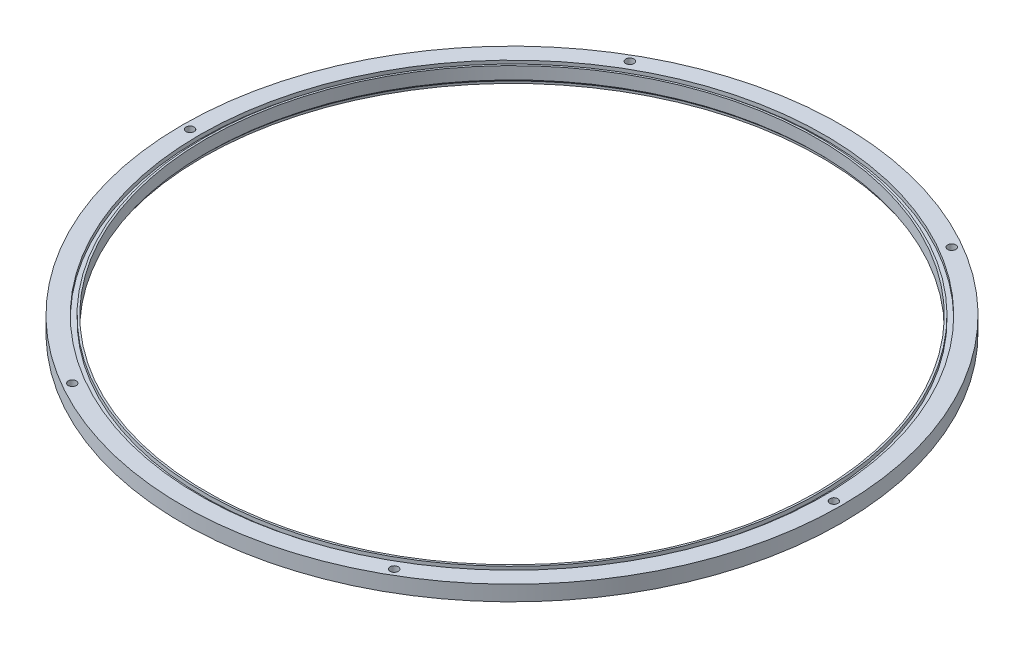
ISO-10303-21;
HEADER;
FILE_DESCRIPTION(('STEP AP214'),'2;1');
FILE_NAME('part.step','',(''),(''),'','','');
FILE_SCHEMA(('AUTOMOTIVE_DESIGN { 1 0 10303 214 1 1 1 1 }'));
ENDSEC;
DATA;
#1=APPLICATION_CONTEXT('core data for automotive mechanical design processes');
#2=APPLICATION_PROTOCOL_DEFINITION('international standard','automotive_design',2000,#1);
#3=PRODUCT_CONTEXT('',#1,'mechanical');
#4=PRODUCT('Part','Part','',(#3));
#5=PRODUCT_RELATED_PRODUCT_CATEGORY('part','',(#4));
#6=PRODUCT_DEFINITION_FORMATION('','',#4);
#7=PRODUCT_DEFINITION_CONTEXT('part definition',#1,'design');
#8=PRODUCT_DEFINITION('design','',#6,#7);
#9=PRODUCT_DEFINITION_SHAPE('','',#8);
#10=(LENGTH_UNIT() NAMED_UNIT(*) SI_UNIT(.MILLI.,.METRE.));
#11=(NAMED_UNIT(*) PLANE_ANGLE_UNIT() SI_UNIT($,.RADIAN.));
#12=(NAMED_UNIT(*) SI_UNIT($,.STERADIAN.) SOLID_ANGLE_UNIT());
#13=UNCERTAINTY_MEASURE_WITH_UNIT(LENGTH_MEASURE(1.E-05),#10,'distance_accuracy_value','');
#14=(GEOMETRIC_REPRESENTATION_CONTEXT(3) GLOBAL_UNCERTAINTY_ASSIGNED_CONTEXT((#13)) GLOBAL_UNIT_ASSIGNED_CONTEXT((#10,
#11,#12)) REPRESENTATION_CONTEXT('',''));
#15=CARTESIAN_POINT('',(0.,0.,0.));
#16=DIRECTION('',(0.,0.,1.));
#17=DIRECTION('',(1.,0.,0.));
#18=AXIS2_PLACEMENT_3D('',#15,#16,#17);
#19=CARTESIAN_POINT('',(168.5,19.,291.8505610754));
#20=DIRECTION('',(0.,-1.,0.));
#21=DIRECTION('',(0.500000000000017,0.,0.866025403784429));
#22=AXIS2_PLACEMENT_3D('',#19,#20,#21);
#23=CYLINDRICAL_SURFACE('',#22,4.25);
#24=CARTESIAN_POINT('',(168.5,19.,291.8505610754));
#25=DIRECTION('',(0.,-1.,0.));
#26=DIRECTION('',(0.500000000000017,0.,0.866025403784429));
#27=AXIS2_PLACEMENT_3D('',#24,#25,#26);
#28=CIRCLE('',#27,4.25);
#29=CARTESIAN_POINT('',(166.375,19.,288.169953109316));
#30=VERTEX_POINT('',#29);
#31=EDGE_CURVE('E204',#30,#30,#28,.T.);
#32=ORIENTED_EDGE('',*,*,#31,.F.);
#33=DIRECTION('',(0.,-1.,0.));
#34=VECTOR('',#33,1.);
#35=CARTESIAN_POINT('',(166.375,19.,288.169953109316));
#36=LINE('',#35,#34);
#37=CARTESIAN_POINT('',(166.375,3.,288.169953109316));
#38=VERTEX_POINT('',#37);
#39=EDGE_CURVE('E11',#30,#38,#36,.T.);
#40=ORIENTED_EDGE('',*,*,#39,.T.);
#41=CARTESIAN_POINT('',(168.5,3.,291.8505610754));
#42=DIRECTION('',(0.,-1.,0.));
#43=DIRECTION('',(0.500000000000017,0.,0.866025403784429));
#44=AXIS2_PLACEMENT_3D('',#41,#42,#43);
#45=CIRCLE('',#44,4.25);
#46=EDGE_CURVE('E185',#38,#38,#45,.T.);
#47=ORIENTED_EDGE('',*,*,#46,.T.);
#48=ORIENTED_EDGE('',*,*,#39,.F.);
#49=EDGE_LOOP('',(#32,#40,#47,#48));
#50=FACE_BOUND('',#49,.T.);
#51=ADVANCED_FACE('F17',(#50),#23,.F.);
#52=CARTESIAN_POINT('',(-168.5,19.,291.8505610754));
#53=DIRECTION('',(0.,-1.,0.));
#54=DIRECTION('',(-0.500000000000017,0.,0.866025403784429));
#55=AXIS2_PLACEMENT_3D('',#52,#53,#54);
#56=CYLINDRICAL_SURFACE('',#55,4.25);
#57=CARTESIAN_POINT('',(-168.5,19.,291.8505610754));
#58=DIRECTION('',(0.,-1.,0.));
#59=DIRECTION('',(-0.500000000000017,0.,0.866025403784429));
#60=AXIS2_PLACEMENT_3D('',#57,#58,#59);
#61=CIRCLE('',#60,4.25);
#62=CARTESIAN_POINT('',(-166.375,19.,288.169953109316));
#63=VERTEX_POINT('',#62);
#64=EDGE_CURVE('E201',#63,#63,#61,.T.);
#65=ORIENTED_EDGE('',*,*,#64,.F.);
#66=DIRECTION('',(0.,-1.,0.));
#67=VECTOR('',#66,1.);
#68=CARTESIAN_POINT('',(-166.375,19.,288.169953109316));
#69=LINE('',#68,#67);
#70=CARTESIAN_POINT('',(-166.375,3.,288.169953109316));
#71=VERTEX_POINT('',#70);
#72=EDGE_CURVE('E21',#63,#71,#69,.T.);
#73=ORIENTED_EDGE('',*,*,#72,.T.);
#74=CARTESIAN_POINT('',(-168.5,3.,291.8505610754));
#75=DIRECTION('',(0.,-1.,0.));
#76=DIRECTION('',(-0.500000000000017,0.,0.866025403784429));
#77=AXIS2_PLACEMENT_3D('',#74,#75,#76);
#78=CIRCLE('',#77,4.25);
#79=EDGE_CURVE('E189',#71,#71,#78,.T.);
#80=ORIENTED_EDGE('',*,*,#79,.T.);
#81=ORIENTED_EDGE('',*,*,#72,.F.);
#82=EDGE_LOOP('',(#65,#73,#80,#81));
#83=FACE_BOUND('',#82,.T.);
#84=ADVANCED_FACE('F295',(#83),#56,.F.);
#85=CARTESIAN_POINT('',(-337.,19.,0.));
#86=DIRECTION('',(0.,-1.,0.));
#87=DIRECTION('',(-1.,0.,0.));
#88=AXIS2_PLACEMENT_3D('',#85,#86,#87);
#89=CYLINDRICAL_SURFACE('',#88,4.25);
#90=CARTESIAN_POINT('',(-337.,19.,0.));
#91=DIRECTION('',(0.,-1.,0.));
#92=DIRECTION('',(-1.,0.,0.));
#93=AXIS2_PLACEMENT_3D('',#90,#91,#92);
#94=CIRCLE('',#93,4.25);
#95=CARTESIAN_POINT('',(-332.75,19.,0.));
#96=VERTEX_POINT('',#95);
#97=EDGE_CURVE('E197',#96,#96,#94,.T.);
#98=ORIENTED_EDGE('',*,*,#97,.F.);
#99=DIRECTION('',(0.,-1.,0.));
#100=VECTOR('',#99,1.);
#101=CARTESIAN_POINT('',(-332.75,19.,0.));
#102=LINE('',#101,#100);
#103=CARTESIAN_POINT('',(-332.75,3.,0.));
#104=VERTEX_POINT('',#103);
#105=EDGE_CURVE('E232',#96,#104,#102,.T.);
#106=ORIENTED_EDGE('',*,*,#105,.T.);
#107=CARTESIAN_POINT('',(-337.,3.,0.));
#108=DIRECTION('',(0.,-1.,0.));
#109=DIRECTION('',(-1.,0.,0.));
#110=AXIS2_PLACEMENT_3D('',#107,#108,#109);
#111=CIRCLE('',#110,4.25);
#112=EDGE_CURVE('E235',#104,#104,#111,.T.);
#113=ORIENTED_EDGE('',*,*,#112,.T.);
#114=ORIENTED_EDGE('',*,*,#105,.F.);
#115=EDGE_LOOP('',(#98,#106,#113,#114));
#116=FACE_BOUND('',#115,.T.);
#117=ADVANCED_FACE('F300',(#116),#89,.F.);
#118=CARTESIAN_POINT('',(-168.5,19.,-291.8505610754));
#119=DIRECTION('',(0.,-1.,0.));
#120=DIRECTION('',(-0.500000000000017,0.,-0.866025403784429));
#121=AXIS2_PLACEMENT_3D('',#118,#119,#120);
#122=CYLINDRICAL_SURFACE('',#121,4.25);
#123=CARTESIAN_POINT('',(-168.5,19.,-291.8505610754));
#124=DIRECTION('',(0.,-1.,0.));
#125=DIRECTION('',(-0.500000000000017,0.,-0.866025403784429));
#126=AXIS2_PLACEMENT_3D('',#123,#124,#125);
#127=CIRCLE('',#126,4.25);
#128=CARTESIAN_POINT('',(-166.375,19.,-288.169953109316));
#129=VERTEX_POINT('',#128);
#130=EDGE_CURVE('E202',#129,#129,#127,.T.);
#131=ORIENTED_EDGE('',*,*,#130,.F.);
#132=DIRECTION('',(0.,-1.,0.));
#133=VECTOR('',#132,1.);
#134=CARTESIAN_POINT('',(-166.375,19.,-288.169953109316));
#135=LINE('',#134,#133);
#136=CARTESIAN_POINT('',(-166.375,3.,-288.169953109316));
#137=VERTEX_POINT('',#136);
#138=EDGE_CURVE('E106',#129,#137,#135,.T.);
#139=ORIENTED_EDGE('',*,*,#138,.T.);
#140=CARTESIAN_POINT('',(-168.5,3.,-291.8505610754));
#141=DIRECTION('',(0.,-1.,0.));
#142=DIRECTION('',(-0.500000000000017,0.,-0.866025403784429));
#143=AXIS2_PLACEMENT_3D('',#140,#141,#142);
#144=CIRCLE('',#143,4.25);
#145=EDGE_CURVE('E233',#137,#137,#144,.T.);
#146=ORIENTED_EDGE('',*,*,#145,.T.);
#147=ORIENTED_EDGE('',*,*,#138,.F.);
#148=EDGE_LOOP('',(#131,#139,#146,#147));
#149=FACE_BOUND('',#148,.T.);
#150=ADVANCED_FACE('F311',(#149),#122,.F.);
#151=CARTESIAN_POINT('',(168.5,19.,-291.8505610754));
#152=DIRECTION('',(0.,-1.,0.));
#153=DIRECTION('',(0.500000000000017,0.,-0.866025403784429));
#154=AXIS2_PLACEMENT_3D('',#151,#152,#153);
#155=CYLINDRICAL_SURFACE('',#154,4.25);
#156=CARTESIAN_POINT('',(168.5,19.,-291.8505610754));
#157=DIRECTION('',(0.,-1.,0.));
#158=DIRECTION('',(0.500000000000017,0.,-0.866025403784429));
#159=AXIS2_PLACEMENT_3D('',#156,#157,#158);
#160=CIRCLE('',#159,4.25);
#161=CARTESIAN_POINT('',(166.375,19.,-288.169953109316));
#162=VERTEX_POINT('',#161);
#163=EDGE_CURVE('E270',#162,#162,#160,.T.);
#164=ORIENTED_EDGE('',*,*,#163,.F.);
#165=DIRECTION('',(0.,-1.,0.));
#166=VECTOR('',#165,1.);
#167=CARTESIAN_POINT('',(166.375,19.,-288.169953109316));
#168=LINE('',#167,#166);
#169=CARTESIAN_POINT('',(166.375,3.,-288.169953109316));
#170=VERTEX_POINT('',#169);
#171=EDGE_CURVE('E117',#162,#170,#168,.T.);
#172=ORIENTED_EDGE('',*,*,#171,.T.);
#173=CARTESIAN_POINT('',(168.5,3.,-291.8505610754));
#174=DIRECTION('',(0.,-1.,0.));
#175=DIRECTION('',(0.500000000000017,0.,-0.866025403784429));
#176=AXIS2_PLACEMENT_3D('',#173,#174,#175);
#177=CIRCLE('',#176,4.25);
#178=EDGE_CURVE('E236',#170,#170,#177,.T.);
#179=ORIENTED_EDGE('',*,*,#178,.T.);
#180=ORIENTED_EDGE('',*,*,#171,.F.);
#181=EDGE_LOOP('',(#164,#172,#179,#180));
#182=FACE_BOUND('',#181,.T.);
#183=ADVANCED_FACE('F307',(#182),#155,.F.);
#184=CARTESIAN_POINT('',(337.,19.,0.));
#185=DIRECTION('',(0.,-1.,0.));
#186=DIRECTION('',(1.,0.,0.));
#187=AXIS2_PLACEMENT_3D('',#184,#185,#186);
#188=CYLINDRICAL_SURFACE('',#187,4.25);
#189=CARTESIAN_POINT('',(337.,19.,0.));
#190=DIRECTION('',(0.,-1.,0.));
#191=DIRECTION('',(1.,0.,0.));
#192=AXIS2_PLACEMENT_3D('',#189,#190,#191);
#193=CIRCLE('',#192,4.25);
#194=CARTESIAN_POINT('',(332.75,19.,0.));
#195=VERTEX_POINT('',#194);
#196=EDGE_CURVE('E254',#195,#195,#193,.T.);
#197=ORIENTED_EDGE('',*,*,#196,.F.);
#198=DIRECTION('',(0.,-1.,0.));
#199=VECTOR('',#198,1.);
#200=CARTESIAN_POINT('',(332.75,19.,0.));
#201=LINE('',#200,#199);
#202=CARTESIAN_POINT('',(332.75,3.,0.));
#203=VERTEX_POINT('',#202);
#204=EDGE_CURVE('E213',#195,#203,#201,.T.);
#205=ORIENTED_EDGE('',*,*,#204,.T.);
#206=CARTESIAN_POINT('',(337.,3.,0.));
#207=DIRECTION('',(0.,-1.,0.));
#208=DIRECTION('',(1.,0.,0.));
#209=AXIS2_PLACEMENT_3D('',#206,#207,#208);
#210=CIRCLE('',#209,4.25);
#211=EDGE_CURVE('E244',#203,#203,#210,.T.);
#212=ORIENTED_EDGE('',*,*,#211,.T.);
#213=ORIENTED_EDGE('',*,*,#204,.F.);
#214=EDGE_LOOP('',(#197,#205,#212,#213));
#215=FACE_BOUND('',#214,.T.);
#216=ADVANCED_FACE('F304',(#215),#188,.F.);
#217=CARTESIAN_POINT('',(0.,-0.95,0.));
#218=DIRECTION('',(0.,1.,0.));
#219=DIRECTION('',(1.,0.,0.));
#220=AXIS2_PLACEMENT_3D('',#217,#218,#219);
#221=CYLINDRICAL_SURFACE('',#220,345.);
#222=CARTESIAN_POINT('',(0.,19.,0.));
#223=DIRECTION('',(0.,1.,0.));
#224=DIRECTION('',(1.,0.,0.));
#225=AXIS2_PLACEMENT_3D('',#222,#223,#224);
#226=CIRCLE('',#225,345.);
#227=CARTESIAN_POINT('',(-345.,19.,0.));
#228=VERTEX_POINT('',#227);
#229=EDGE_CURVE('E196',#228,#228,#226,.T.);
#230=ORIENTED_EDGE('',*,*,#229,.F.);
#231=DIRECTION('',(0.,-1.,0.));
#232=VECTOR('',#231,1.);
#233=CARTESIAN_POINT('',(-345.,-0.95,0.));
#234=LINE('',#233,#232);
#235=CARTESIAN_POINT('',(-345.,3.,0.));
#236=VERTEX_POINT('',#235);
#237=EDGE_CURVE('E206',#228,#236,#234,.T.);
#238=ORIENTED_EDGE('',*,*,#237,.T.);
#239=CARTESIAN_POINT('',(0.,3.,0.));
#240=DIRECTION('',(0.,-1.,0.));
#241=DIRECTION('',(1.,0.,0.));
#242=AXIS2_PLACEMENT_3D('',#239,#240,#241);
#243=CIRCLE('',#242,345.);
#244=EDGE_CURVE('E169',#236,#236,#243,.T.);
#245=ORIENTED_EDGE('',*,*,#244,.F.);
#246=ORIENTED_EDGE('',*,*,#237,.F.);
#247=EDGE_LOOP('',(#230,#238,#245,#246));
#248=FACE_BOUND('',#247,.T.);
#249=ADVANCED_FACE('F306',(#248),#221,.T.);
#250=CARTESIAN_POINT('',(0.,19.,0.));
#251=DIRECTION('',(0.,1.,0.));
#252=DIRECTION('',(1.,0.,0.));
#253=AXIS2_PLACEMENT_3D('',#250,#251,#252);
#254=PLANE('',#253);
#255=ORIENTED_EDGE('',*,*,#31,.T.);
#256=EDGE_LOOP('',(#255));
#257=FACE_BOUND('',#256,.T.);
#258=ORIENTED_EDGE('',*,*,#64,.T.);
#259=EDGE_LOOP('',(#258));
#260=FACE_BOUND('',#259,.T.);
#261=ORIENTED_EDGE('',*,*,#97,.T.);
#262=EDGE_LOOP('',(#261));
#263=FACE_BOUND('',#262,.T.);
#264=ORIENTED_EDGE('',*,*,#130,.T.);
#265=EDGE_LOOP('',(#264));
#266=FACE_BOUND('',#265,.T.);
#267=ORIENTED_EDGE('',*,*,#163,.T.);
#268=EDGE_LOOP('',(#267));
#269=FACE_BOUND('',#268,.T.);
#270=ORIENTED_EDGE('',*,*,#196,.T.);
#271=EDGE_LOOP('',(#270));
#272=FACE_BOUND('',#271,.T.);
#273=CARTESIAN_POINT('',(0.,19.,0.));
#274=DIRECTION('',(0.,1.,0.));
#275=DIRECTION('',(1.,0.,0.));
#276=AXIS2_PLACEMENT_3D('',#273,#274,#275);
#277=CIRCLE('',#276,327.);
#278=CARTESIAN_POINT('',(-327.,19.,0.));
#279=VERTEX_POINT('',#278);
#280=EDGE_CURVE('E193',#279,#279,#277,.T.);
#281=ORIENTED_EDGE('',*,*,#280,.F.);
#282=EDGE_LOOP('',(#281));
#283=FACE_BOUND('',#282,.T.);
#284=ORIENTED_EDGE('',*,*,#229,.T.);
#285=EDGE_LOOP('',(#284));
#286=FACE_BOUND('',#285,.T.);
#287=ADVANCED_FACE('F19',(#257,#260,#263,#266,#269,#272,#283,#286),#254,.T.);
#288=CARTESIAN_POINT('',(0.,-0.95,0.));
#289=DIRECTION('',(0.,1.,0.));
#290=DIRECTION('',(1.,0.,0.));
#291=AXIS2_PLACEMENT_3D('',#288,#289,#290);
#292=CYLINDRICAL_SURFACE('',#291,327.);
#293=CARTESIAN_POINT('',(0.,15.,0.));
#294=DIRECTION('',(0.,1.,0.));
#295=DIRECTION('',(1.,0.,0.));
#296=AXIS2_PLACEMENT_3D('',#293,#294,#295);
#297=CIRCLE('',#296,327.);
#298=CARTESIAN_POINT('',(-327.,15.,0.));
#299=VERTEX_POINT('',#298);
#300=EDGE_CURVE('E179',#299,#299,#297,.T.);
#301=ORIENTED_EDGE('',*,*,#300,.F.);
#302=DIRECTION('',(0.,1.,0.));
#303=VECTOR('',#302,1.);
#304=CARTESIAN_POINT('',(-327.,-0.95,0.));
#305=LINE('',#304,#303);
#306=EDGE_CURVE('E183',#299,#279,#305,.T.);
#307=ORIENTED_EDGE('',*,*,#306,.T.);
#308=ORIENTED_EDGE('',*,*,#280,.T.);
#309=ORIENTED_EDGE('',*,*,#306,.F.);
#310=EDGE_LOOP('',(#301,#307,#308,#309));
#311=FACE_BOUND('',#310,.T.);
#312=ADVANCED_FACE('F316',(#311),#292,.F.);
#313=CARTESIAN_POINT('',(0.,15.,0.));
#314=DIRECTION('',(0.,1.,0.));
#315=DIRECTION('',(1.,0.,0.));
#316=AXIS2_PLACEMENT_3D('',#313,#314,#315);
#317=PLANE('',#316);
#318=CARTESIAN_POINT('',(0.,15.,0.));
#319=DIRECTION('',(0.,1.,0.));
#320=DIRECTION('',(1.,0.,0.));
#321=AXIS2_PLACEMENT_3D('',#318,#319,#320);
#322=CIRCLE('',#321,322.);
#323=CARTESIAN_POINT('',(-322.,15.,0.));
#324=VERTEX_POINT('',#323);
#325=EDGE_CURVE('E184',#324,#324,#322,.T.);
#326=ORIENTED_EDGE('',*,*,#325,.F.);
#327=EDGE_LOOP('',(#326));
#328=FACE_BOUND('',#327,.T.);
#329=ORIENTED_EDGE('',*,*,#300,.T.);
#330=EDGE_LOOP('',(#329));
#331=FACE_BOUND('',#330,.T.);
#332=ADVANCED_FACE('F313',(#328,#331),#317,.T.);
#333=CARTESIAN_POINT('',(0.,-0.95,0.));
#334=DIRECTION('',(0.,1.,0.));
#335=DIRECTION('',(1.,0.,0.));
#336=AXIS2_PLACEMENT_3D('',#333,#334,#335);
#337=CYLINDRICAL_SURFACE('',#336,322.);
#338=CARTESIAN_POINT('',(0.,19.,0.));
#339=DIRECTION('',(0.,1.,0.));
#340=DIRECTION('',(1.,0.,0.));
#341=AXIS2_PLACEMENT_3D('',#338,#339,#340);
#342=CIRCLE('',#341,322.);
#343=CARTESIAN_POINT('',(-322.,19.,0.));
#344=VERTEX_POINT('',#343);
#345=EDGE_CURVE('E174',#344,#344,#342,.T.);
#346=ORIENTED_EDGE('',*,*,#345,.F.);
#347=DIRECTION('',(0.,-1.,0.));
#348=VECTOR('',#347,1.);
#349=CARTESIAN_POINT('',(-322.,-0.95,0.));
#350=LINE('',#349,#348);
#351=EDGE_CURVE('E178',#344,#324,#350,.T.);
#352=ORIENTED_EDGE('',*,*,#351,.T.);
#353=ORIENTED_EDGE('',*,*,#325,.T.);
#354=ORIENTED_EDGE('',*,*,#351,.F.);
#355=EDGE_LOOP('',(#346,#352,#353,#354));
#356=FACE_BOUND('',#355,.T.);
#357=ADVANCED_FACE('F315',(#356),#337,.T.);
#358=CARTESIAN_POINT('',(0.,19.,0.));
#359=DIRECTION('',(0.,1.,0.));
#360=DIRECTION('',(1.,0.,0.));
#361=AXIS2_PLACEMENT_3D('',#358,#359,#360);
#362=PLANE('',#361);
#363=CARTESIAN_POINT('',(0.,19.,0.));
#364=DIRECTION('',(0.,1.,0.));
#365=DIRECTION('',(1.,0.,0.));
#366=AXIS2_PLACEMENT_3D('',#363,#364,#365);
#367=CIRCLE('',#366,320.);
#368=CARTESIAN_POINT('',(-320.,19.,0.));
#369=VERTEX_POINT('',#368);
#370=EDGE_CURVE('E167',#369,#369,#367,.T.);
#371=ORIENTED_EDGE('',*,*,#370,.F.);
#372=EDGE_LOOP('',(#371));
#373=FACE_BOUND('',#372,.T.);
#374=ORIENTED_EDGE('',*,*,#345,.T.);
#375=EDGE_LOOP('',(#374));
#376=FACE_BOUND('',#375,.T.);
#377=ADVANCED_FACE('F322',(#373,#376),#362,.T.);
#378=CARTESIAN_POINT('',(0.,-0.95,0.));
#379=DIRECTION('',(0.,1.,0.));
#380=DIRECTION('',(1.,0.,0.));
#381=AXIS2_PLACEMENT_3D('',#378,#379,#380);
#382=CYLINDRICAL_SURFACE('',#381,320.);
#383=CARTESIAN_POINT('',(0.,6.,0.));
#384=DIRECTION('',(0.,1.,0.));
#385=DIRECTION('',(-1.,0.,0.));
#386=AXIS2_PLACEMENT_3D('',#383,#384,#385);
#387=CIRCLE('',#386,320.);
#388=CARTESIAN_POINT('',(0.,5.99999999999906,320.));
#389=VERTEX_POINT('',#388);
#390=CARTESIAN_POINT('',(-320.,6.,0.));
#391=VERTEX_POINT('',#390);
#392=EDGE_CURVE('E154',#389,#391,#387,.T.);
#393=ORIENTED_EDGE('',*,*,#392,.F.);
#394=CARTESIAN_POINT('',(0.,6.,0.));
#395=DIRECTION('',(0.,1.,0.));
#396=DIRECTION('',(-1.,0.,0.));
#397=AXIS2_PLACEMENT_3D('',#394,#395,#396);
#398=CIRCLE('',#397,320.);
#399=EDGE_CURVE('E145',#391,#389,#398,.T.);
#400=ORIENTED_EDGE('',*,*,#399,.F.);
#401=DIRECTION('',(0.,1.,0.));
#402=VECTOR('',#401,1.);
#403=CARTESIAN_POINT('',(-320.,-0.95,0.));
#404=LINE('',#403,#402);
#405=EDGE_CURVE('E148',#391,#369,#404,.T.);
#406=ORIENTED_EDGE('',*,*,#405,.T.);
#407=ORIENTED_EDGE('',*,*,#370,.T.);
#408=ORIENTED_EDGE('',*,*,#405,.F.);
#409=EDGE_LOOP('',(#393,#400,#406,#407,#408));
#410=FACE_BOUND('',#409,.T.);
#411=ADVANCED_FACE('F290',(#410),#382,.F.);
#412=CARTESIAN_POINT('',(0.,4.500000001398,0.));
#413=DIRECTION('',(0.,-1.,0.));
#414=DIRECTION('',(0.,0.,-1.));
#415=AXIS2_PLACEMENT_3D('',#412,#413,#414);
#416=CONICAL_SURFACE('',#415,321.4999999986,0.785398163397448);
#417=ORIENTED_EDGE('',*,*,#392,.T.);
#418=ORIENTED_EDGE('',*,*,#399,.T.);
#419=DIRECTION('',(0.,-0.707106781186548,0.707106781186548));
#420=VECTOR('',#419,1.);
#421=CARTESIAN_POINT('',(0.,4.500000001398,321.4999999986));
#422=LINE('',#421,#420);
#423=CARTESIAN_POINT('',(0.,2.99999999999895,323.));
#424=VERTEX_POINT('',#423);
#425=EDGE_CURVE('E135',#389,#424,#422,.T.);
#426=ORIENTED_EDGE('',*,*,#425,.T.);
#427=CARTESIAN_POINT('',(0.,3.,0.));
#428=DIRECTION('',(0.,1.,0.));
#429=DIRECTION('',(-1.,0.,0.));
#430=AXIS2_PLACEMENT_3D('',#427,#428,#429);
#431=CIRCLE('',#430,323.);
#432=EDGE_CURVE('E143',#424,#424,#431,.T.);
#433=ORIENTED_EDGE('',*,*,#432,.F.);
#434=ORIENTED_EDGE('',*,*,#425,.F.);
#435=EDGE_LOOP('',(#417,#418,#426,#433,#434));
#436=FACE_BOUND('',#435,.T.);
#437=ADVANCED_FACE('F142',(#436),#416,.F.);
#438=CARTESIAN_POINT('',(0.,3.,0.));
#439=DIRECTION('',(0.,1.,0.));
#440=DIRECTION('',(1.,0.,0.));
#441=AXIS2_PLACEMENT_3D('',#438,#439,#440);
#442=PLANE('',#441);
#443=ORIENTED_EDGE('',*,*,#432,.T.);
#444=EDGE_LOOP('',(#443));
#445=FACE_BOUND('',#444,.T.);
#446=CARTESIAN_POINT('',(0.,3.,0.));
#447=DIRECTION('',(0.,1.,0.));
#448=DIRECTION('',(1.,0.,0.));
#449=AXIS2_PLACEMENT_3D('',#446,#447,#448);
#450=CIRCLE('',#449,324.);
#451=CARTESIAN_POINT('',(-324.,3.,0.));
#452=VERTEX_POINT('',#451);
#453=EDGE_CURVE('E155',#452,#452,#450,.T.);
#454=ORIENTED_EDGE('',*,*,#453,.F.);
#455=EDGE_LOOP('',(#454));
#456=FACE_BOUND('',#455,.T.);
#457=ADVANCED_FACE('F151',(#445,#456),#442,.F.);
#458=CARTESIAN_POINT('',(0.,-0.95,0.));
#459=DIRECTION('',(0.,1.,0.));
#460=DIRECTION('',(1.,0.,0.));
#461=AXIS2_PLACEMENT_3D('',#458,#459,#460);
#462=CYLINDRICAL_SURFACE('',#461,324.);
#463=CARTESIAN_POINT('',(0.,0.,0.));
#464=DIRECTION('',(0.,1.,0.));
#465=DIRECTION('',(1.,0.,0.));
#466=AXIS2_PLACEMENT_3D('',#463,#464,#465);
#467=CIRCLE('',#466,324.);
#468=CARTESIAN_POINT('',(-324.,0.,0.));
#469=VERTEX_POINT('',#468);
#470=EDGE_CURVE('E227',#469,#469,#467,.T.);
#471=ORIENTED_EDGE('',*,*,#470,.F.);
#472=DIRECTION('',(0.,1.,0.));
#473=VECTOR('',#472,1.);
#474=CARTESIAN_POINT('',(-324.,-0.95,0.));
#475=LINE('',#474,#473);
#476=EDGE_CURVE('E163',#469,#452,#475,.T.);
#477=ORIENTED_EDGE('',*,*,#476,.T.);
#478=ORIENTED_EDGE('',*,*,#453,.T.);
#479=ORIENTED_EDGE('',*,*,#476,.F.);
#480=EDGE_LOOP('',(#471,#477,#478,#479));
#481=FACE_BOUND('',#480,.T.);
#482=ADVANCED_FACE('F280',(#481),#462,.F.);
#483=CARTESIAN_POINT('',(0.,0.,0.));
#484=DIRECTION('',(0.,1.,0.));
#485=DIRECTION('',(1.,0.,0.));
#486=AXIS2_PLACEMENT_3D('',#483,#484,#485);
#487=PLANE('',#486);
#488=ORIENTED_EDGE('',*,*,#470,.T.);
#489=EDGE_LOOP('',(#488));
#490=FACE_BOUND('',#489,.T.);
#491=CARTESIAN_POINT('',(0.,0.,0.));
#492=DIRECTION('',(0.,1.,0.));
#493=DIRECTION('',(1.,0.,0.));
#494=AXIS2_PLACEMENT_3D('',#491,#492,#493);
#495=CIRCLE('',#494,327.);
#496=CARTESIAN_POINT('',(-327.,0.,0.));
#497=VERTEX_POINT('',#496);
#498=EDGE_CURVE('E225',#497,#497,#495,.T.);
#499=ORIENTED_EDGE('',*,*,#498,.F.);
#500=EDGE_LOOP('',(#499));
#501=FACE_BOUND('',#500,.T.);
#502=ADVANCED_FACE('F277',(#490,#501),#487,.F.);
#503=CARTESIAN_POINT('',(0.,-0.95,0.));
#504=DIRECTION('',(0.,1.,0.));
#505=DIRECTION('',(1.,0.,0.));
#506=AXIS2_PLACEMENT_3D('',#503,#504,#505);
#507=CYLINDRICAL_SURFACE('',#506,327.);
#508=CARTESIAN_POINT('',(0.,3.,0.));
#509=DIRECTION('',(0.,1.,0.));
#510=DIRECTION('',(1.,0.,0.));
#511=AXIS2_PLACEMENT_3D('',#508,#509,#510);
#512=CIRCLE('',#511,327.);
#513=CARTESIAN_POINT('',(-327.,3.,0.));
#514=VERTEX_POINT('',#513);
#515=EDGE_CURVE('E173',#514,#514,#512,.T.);
#516=ORIENTED_EDGE('',*,*,#515,.F.);
#517=DIRECTION('',(0.,-1.,0.));
#518=VECTOR('',#517,1.);
#519=CARTESIAN_POINT('',(-327.,-0.95,0.));
#520=LINE('',#519,#518);
#521=EDGE_CURVE('E188',#514,#497,#520,.T.);
#522=ORIENTED_EDGE('',*,*,#521,.T.);
#523=ORIENTED_EDGE('',*,*,#498,.T.);
#524=ORIENTED_EDGE('',*,*,#521,.F.);
#525=EDGE_LOOP('',(#516,#522,#523,#524));
#526=FACE_BOUND('',#525,.T.);
#527=ADVANCED_FACE('F361',(#526),#507,.T.);
#528=CARTESIAN_POINT('',(0.,3.,0.));
#529=DIRECTION('',(0.,1.,0.));
#530=DIRECTION('',(1.,0.,0.));
#531=AXIS2_PLACEMENT_3D('',#528,#529,#530);
#532=PLANE('',#531);
#533=ORIENTED_EDGE('',*,*,#46,.F.);
#534=EDGE_LOOP('',(#533));
#535=FACE_BOUND('',#534,.T.);
#536=ORIENTED_EDGE('',*,*,#79,.F.);
#537=EDGE_LOOP('',(#536));
#538=FACE_BOUND('',#537,.T.);
#539=ORIENTED_EDGE('',*,*,#112,.F.);
#540=EDGE_LOOP('',(#539));
#541=FACE_BOUND('',#540,.T.);
#542=ORIENTED_EDGE('',*,*,#145,.F.);
#543=EDGE_LOOP('',(#542));
#544=FACE_BOUND('',#543,.T.);
#545=ORIENTED_EDGE('',*,*,#178,.F.);
#546=EDGE_LOOP('',(#545));
#547=FACE_BOUND('',#546,.T.);
#548=ORIENTED_EDGE('',*,*,#211,.F.);
#549=EDGE_LOOP('',(#548));
#550=FACE_BOUND('',#549,.T.);
#551=ORIENTED_EDGE('',*,*,#515,.T.);
#552=EDGE_LOOP('',(#551));
#553=FACE_BOUND('',#552,.T.);
#554=ORIENTED_EDGE('',*,*,#244,.T.);
#555=EDGE_LOOP('',(#554));
#556=FACE_BOUND('',#555,.T.);
#557=ADVANCED_FACE('F358',(#535,#538,#541,#544,#547,#550,#553,#556),#532,.F.);
#558=CLOSED_SHELL('',(#51,#84,#117,#150,#183,#216,#249,#287,#312,#332,#357,#377,#411,#437,#457,
#482,#502,#527,#557));
#559=MANIFOLD_SOLID_BREP('B1',#558);
#560=ADVANCED_BREP_SHAPE_REPRESENTATION('',(#18,#559),#14);
#561=SHAPE_DEFINITION_REPRESENTATION(#9,#560);
ENDSEC;
END-ISO-10303-21;
